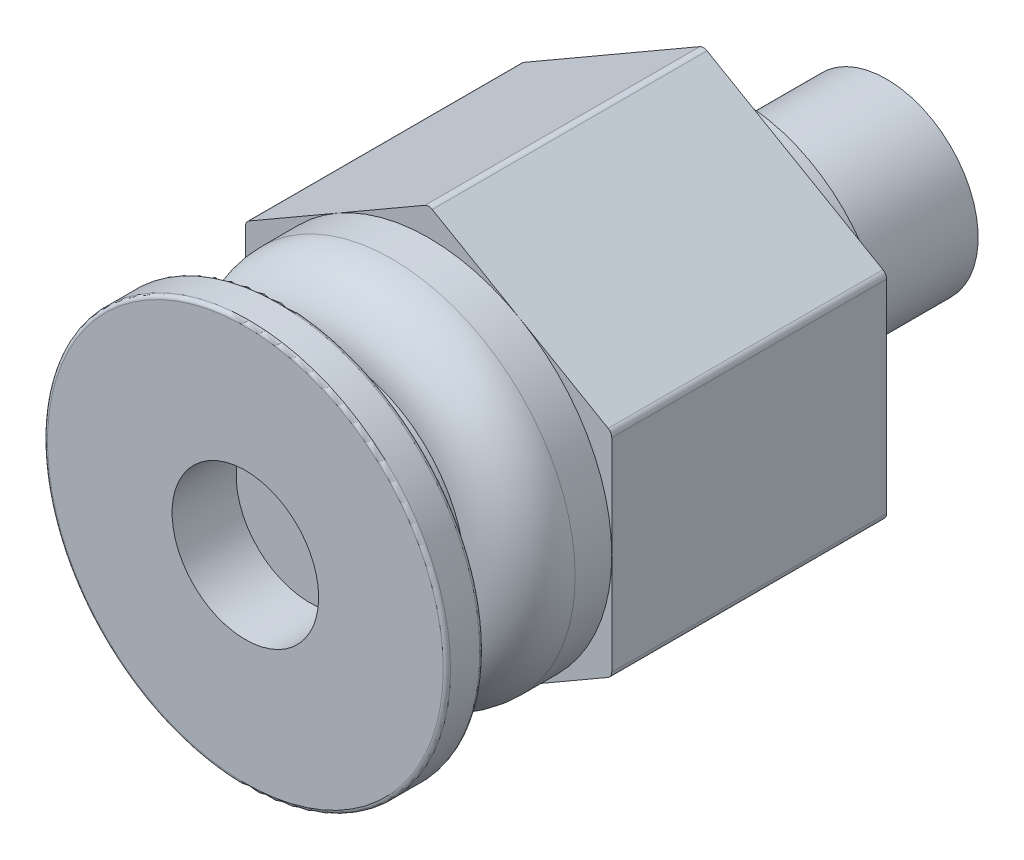
ISO-10303-21;
HEADER;
FILE_DESCRIPTION(('STEP AP214'),'2;1');
FILE_NAME('part.step','',(''),(''),'','','');
FILE_SCHEMA(('AUTOMOTIVE_DESIGN { 1 0 10303 214 1 1 1 1 }'));
ENDSEC;
DATA;
#1=APPLICATION_CONTEXT('core data for automotive mechanical design processes');
#2=APPLICATION_PROTOCOL_DEFINITION('international standard','automotive_design',2000,#1);
#3=PRODUCT_CONTEXT('',#1,'mechanical');
#4=PRODUCT('Part','Part','',(#3));
#5=PRODUCT_RELATED_PRODUCT_CATEGORY('part','',(#4));
#6=PRODUCT_DEFINITION_FORMATION('','',#4);
#7=PRODUCT_DEFINITION_CONTEXT('part definition',#1,'design');
#8=PRODUCT_DEFINITION('design','',#6,#7);
#9=PRODUCT_DEFINITION_SHAPE('','',#8);
#10=(LENGTH_UNIT() NAMED_UNIT(*) SI_UNIT(.MILLI.,.METRE.));
#11=(NAMED_UNIT(*) PLANE_ANGLE_UNIT() SI_UNIT($,.RADIAN.));
#12=(NAMED_UNIT(*) SI_UNIT($,.STERADIAN.) SOLID_ANGLE_UNIT());
#13=UNCERTAINTY_MEASURE_WITH_UNIT(LENGTH_MEASURE(1.E-05),#10,'distance_accuracy_value','');
#14=(GEOMETRIC_REPRESENTATION_CONTEXT(3) GLOBAL_UNCERTAINTY_ASSIGNED_CONTEXT((#13)) GLOBAL_UNIT_ASSIGNED_CONTEXT((#10,
#11,#12)) REPRESENTATION_CONTEXT('',''));
#15=CARTESIAN_POINT('',(0.,0.,0.));
#16=DIRECTION('',(0.,0.,1.));
#17=DIRECTION('',(1.,0.,0.));
#18=AXIS2_PLACEMENT_3D('',#15,#16,#17);
#19=CARTESIAN_POINT('',(0.,0.,15.75));
#20=DIRECTION('',(0.,0.,0.999999999999999));
#21=DIRECTION('',(1.,0.,0.));
#22=AXIS2_PLACEMENT_3D('',#19,#20,#21);
#23=PLANE('',#22);
#24=CARTESIAN_POINT('',(0.,0.,15.75));
#25=DIRECTION('',(0.,0.,-0.999999999999999));
#26=DIRECTION('',(-1.,0.,0.));
#27=AXIS2_PLACEMENT_3D('',#24,#25,#26);
#28=CIRCLE('',#27,2.);
#29=CARTESIAN_POINT('',(1.99999999999997,0.,15.7500000000003));
#30=VERTEX_POINT('',#29);
#31=EDGE_CURVE('E19',#30,#30,#28,.F.);
#32=ORIENTED_EDGE('',*,*,#31,.T.);
#33=EDGE_LOOP('',(#32));
#34=FACE_BOUND('',#33,.T.);
#35=ADVANCED_FACE('F16',(#34),#23,.T.);
#36=CARTESIAN_POINT('',(0.,0.,-6.17664109060523));
#37=DIRECTION('',(0.,0.,-0.999999999999999));
#38=DIRECTION('',(-1.,0.,0.));
#39=AXIS2_PLACEMENT_3D('',#36,#37,#38);
#40=CYLINDRICAL_SURFACE('',#39,2.);
#41=ORIENTED_EDGE('',*,*,#31,.F.);
#42=EDGE_LOOP('',(#41));
#43=FACE_BOUND('',#42,.T.);
#44=CARTESIAN_POINT('',(0.,0.,17.5000000000001));
#45=DIRECTION('',(0.,0.,-0.999999999999999));
#46=DIRECTION('',(-1.,0.,0.));
#47=AXIS2_PLACEMENT_3D('',#44,#45,#46);
#48=CIRCLE('',#47,2.);
#49=CARTESIAN_POINT('',(1.9999999999999,0.,17.4999999999999));
#50=VERTEX_POINT('',#49);
#51=EDGE_CURVE('E34',#50,#50,#48,.T.);
#52=ORIENTED_EDGE('',*,*,#51,.F.);
#53=EDGE_LOOP('',(#52));
#54=FACE_BOUND('',#53,.T.);
#55=ADVANCED_FACE('F362',(#43,#54),#40,.F.);
#56=CARTESIAN_POINT('',(0.,0.,17.5000000000001));
#57=DIRECTION('',(0.,0.,0.999999999999999));
#58=DIRECTION('',(1.,0.,0.));
#59=AXIS2_PLACEMENT_3D('',#56,#57,#58);
#60=PLANE('',#59);
#61=ORIENTED_EDGE('',*,*,#51,.T.);
#62=EDGE_LOOP('',(#61));
#63=FACE_BOUND('',#62,.T.);
#64=CARTESIAN_POINT('',(0.,0.,17.5));
#65=DIRECTION('',(0.,0.,-0.999999999999999));
#66=DIRECTION('',(1.,0.,0.));
#67=AXIS2_PLACEMENT_3D('',#64,#65,#66);
#68=CIRCLE('',#67,5.39999999999998);
#69=CARTESIAN_POINT('',(5.39999999999995,0.,17.5000000000002));
#70=VERTEX_POINT('',#69);
#71=EDGE_CURVE('E257',#70,#70,#68,.T.);
#72=ORIENTED_EDGE('',*,*,#71,.F.);
#73=EDGE_LOOP('',(#72));
#74=FACE_BOUND('',#73,.T.);
#75=ADVANCED_FACE('F268',(#63,#74),#60,.T.);
#76=CARTESIAN_POINT('',(0.,0.,17.4));
#77=DIRECTION('',(0.,0.,0.999999999999999));
#78=DIRECTION('',(-1.,0.,0.));
#79=AXIS2_PLACEMENT_3D('',#76,#77,#78);
#80=TOROIDAL_SURFACE('',#79,5.39999999999997,0.1);
#81=ORIENTED_EDGE('',*,*,#71,.T.);
#82=EDGE_LOOP('',(#81));
#83=FACE_BOUND('',#82,.T.);
#84=CARTESIAN_POINT('',(0.,0.,17.4000000000001));
#85=DIRECTION('',(0.,0.,-0.999999999999999));
#86=DIRECTION('',(-1.,0.,0.));
#87=AXIS2_PLACEMENT_3D('',#84,#85,#86);
#88=CIRCLE('',#87,5.5);
#89=CARTESIAN_POINT('',(-5.50000000000009,0.,17.4));
#90=VERTEX_POINT('',#89);
#91=CARTESIAN_POINT('',(5.49999999999995,0.,17.4000000000002));
#92=VERTEX_POINT('',#91);
#93=EDGE_CURVE('E242',#90,#92,#88,.T.);
#94=ORIENTED_EDGE('',*,*,#93,.F.);
#95=CARTESIAN_POINT('',(0.,0.,17.4000000000001));
#96=DIRECTION('',(0.,0.,-0.999999999999999));
#97=DIRECTION('',(-1.,0.,0.));
#98=AXIS2_PLACEMENT_3D('',#95,#96,#97);
#99=CIRCLE('',#98,5.5);
#100=EDGE_CURVE('E255',#92,#90,#99,.T.);
#101=ORIENTED_EDGE('',*,*,#100,.F.);
#102=EDGE_LOOP('',(#94,#101));
#103=FACE_BOUND('',#102,.T.);
#104=ADVANCED_FACE('F263',(#83,#103),#80,.T.);
#105=CARTESIAN_POINT('',(0.,0.,16.5000000000002));
#106=DIRECTION('',(0.,0.,-0.999999999999999));
#107=DIRECTION('',(-1.,0.,0.));
#108=AXIS2_PLACEMENT_3D('',#105,#106,#107);
#109=CYLINDRICAL_SURFACE('',#108,5.5);
#110=CARTESIAN_POINT('',(0.,0.,16.6000000000002));
#111=DIRECTION('',(0.,0.,-0.999999999999999));
#112=DIRECTION('',(-1.,0.,0.));
#113=AXIS2_PLACEMENT_3D('',#110,#111,#112);
#114=CIRCLE('',#113,5.5);
#115=CARTESIAN_POINT('',(5.49999999999995,0.,16.6000000000001));
#116=VERTEX_POINT('',#115);
#117=CARTESIAN_POINT('',(-5.50000000000004,0.,16.6000000000001));
#118=VERTEX_POINT('',#117);
#119=EDGE_CURVE('E237',#116,#118,#114,.T.);
#120=ORIENTED_EDGE('',*,*,#119,.F.);
#121=CARTESIAN_POINT('',(0.,0.,16.6000000000002));
#122=DIRECTION('',(0.,0.,-0.999999999999999));
#123=DIRECTION('',(-1.,0.,0.));
#124=AXIS2_PLACEMENT_3D('',#121,#122,#123);
#125=CIRCLE('',#124,5.5);
#126=EDGE_CURVE('E240',#118,#116,#125,.T.);
#127=ORIENTED_EDGE('',*,*,#126,.F.);
#128=EDGE_LOOP('',(#120,#127));
#129=FACE_BOUND('',#128,.T.);
#130=ORIENTED_EDGE('',*,*,#100,.T.);
#131=ORIENTED_EDGE('',*,*,#93,.T.);
#132=EDGE_LOOP('',(#130,#131));
#133=FACE_BOUND('',#132,.T.);
#134=ADVANCED_FACE('F267',(#129,#133),#109,.T.);
#135=CARTESIAN_POINT('',(0.,0.,16.6000000000001));
#136=DIRECTION('',(0.,0.,-0.999999999999999));
#137=DIRECTION('',(-1.,0.,0.));
#138=AXIS2_PLACEMENT_3D('',#135,#136,#137);
#139=TOROIDAL_SURFACE('',#138,5.40000000000007,0.1);
#140=ORIENTED_EDGE('',*,*,#126,.T.);
#141=ORIENTED_EDGE('',*,*,#119,.T.);
#142=EDGE_LOOP('',(#140,#141));
#143=FACE_BOUND('',#142,.T.);
#144=CARTESIAN_POINT('',(0.,0.,16.5000000000001));
#145=DIRECTION('',(0.,0.,0.999999999999999));
#146=DIRECTION('',(-1.,0.,0.));
#147=AXIS2_PLACEMENT_3D('',#144,#145,#146);
#148=CIRCLE('',#147,5.40000000000007);
#149=CARTESIAN_POINT('',(-5.40000000000006,0.,16.5000000000002));
#150=VERTEX_POINT('',#149);
#151=EDGE_CURVE('E239',#150,#150,#148,.T.);
#152=ORIENTED_EDGE('',*,*,#151,.T.);
#153=EDGE_LOOP('',(#152));
#154=FACE_BOUND('',#153,.T.);
#155=ADVANCED_FACE('F221',(#143,#154),#139,.T.);
#156=CARTESIAN_POINT('',(0.,0.,16.5000000000002));
#157=DIRECTION('',(0.,0.,0.999999999999999));
#158=DIRECTION('',(1.,0.,0.));
#159=AXIS2_PLACEMENT_3D('',#156,#157,#158);
#160=PLANE('',#159);
#161=CARTESIAN_POINT('',(0.,0.,16.5000000000002));
#162=DIRECTION('',(0.,0.,-0.999999999999999));
#163=DIRECTION('',(-1.,0.,0.));
#164=AXIS2_PLACEMENT_3D('',#161,#162,#163);
#165=CIRCLE('',#164,2.5);
#166=CARTESIAN_POINT('',(-2.50000000000004,0.,16.5));
#167=VERTEX_POINT('',#166);
#168=EDGE_CURVE('E359',#167,#167,#165,.T.);
#169=ORIENTED_EDGE('',*,*,#168,.F.);
#170=EDGE_LOOP('',(#169));
#171=FACE_BOUND('',#170,.T.);
#172=ORIENTED_EDGE('',*,*,#151,.F.);
#173=EDGE_LOOP('',(#172));
#174=FACE_BOUND('',#173,.T.);
#175=ADVANCED_FACE('F216',(#171,#174),#160,.F.);
#176=CARTESIAN_POINT('',(0.,0.,15.0000000000002));
#177=DIRECTION('',(0.,0.,-0.999999999999999));
#178=DIRECTION('',(-1.,0.,0.));
#179=AXIS2_PLACEMENT_3D('',#176,#177,#178);
#180=CYLINDRICAL_SURFACE('',#179,2.5);
#181=CARTESIAN_POINT('',(0.,0.,15.75));
#182=DIRECTION('',(0.,0.,-0.999999999999999));
#183=DIRECTION('',(-1.,0.,0.));
#184=AXIS2_PLACEMENT_3D('',#181,#182,#183);
#185=CIRCLE('',#184,2.5);
#186=CARTESIAN_POINT('',(-2.50000000000006,0.,15.75));
#187=VERTEX_POINT('',#186);
#188=EDGE_CURVE('E357',#187,#187,#185,.T.);
#189=ORIENTED_EDGE('',*,*,#188,.F.);
#190=EDGE_LOOP('',(#189));
#191=FACE_BOUND('',#190,.T.);
#192=ORIENTED_EDGE('',*,*,#168,.T.);
#193=EDGE_LOOP('',(#192));
#194=FACE_BOUND('',#193,.T.);
#195=ADVANCED_FACE('F212',(#191,#194),#180,.T.);
#196=CARTESIAN_POINT('',(0.,0.,15.75));
#197=DIRECTION('',(0.,0.,0.999999999999999));
#198=DIRECTION('',(1.,0.,0.));
#199=AXIS2_PLACEMENT_3D('',#196,#197,#198);
#200=PLANE('',#199);
#201=ORIENTED_EDGE('',*,*,#188,.T.);
#202=EDGE_LOOP('',(#201));
#203=FACE_BOUND('',#202,.T.);
#204=CARTESIAN_POINT('',(0.,0.,15.75));
#205=DIRECTION('',(0.,0.,-0.999999999999999));
#206=DIRECTION('',(-1.,0.,0.));
#207=AXIS2_PLACEMENT_3D('',#204,#205,#206);
#208=CIRCLE('',#207,3.5);
#209=CARTESIAN_POINT('',(-3.50000000000005,0.,15.7500000000004));
#210=VERTEX_POINT('',#209);
#211=EDGE_CURVE('E355',#210,#210,#208,.T.);
#212=ORIENTED_EDGE('',*,*,#211,.F.);
#213=EDGE_LOOP('',(#212));
#214=FACE_BOUND('',#213,.T.);
#215=ADVANCED_FACE('F208',(#203,#214),#200,.T.);
#216=CARTESIAN_POINT('',(0.,0.,15.0000000000002));
#217=DIRECTION('',(0.,0.,-0.999999999999999));
#218=DIRECTION('',(-1.,0.,0.));
#219=AXIS2_PLACEMENT_3D('',#216,#217,#218);
#220=CYLINDRICAL_SURFACE('',#219,3.5);
#221=ORIENTED_EDGE('',*,*,#211,.T.);
#222=EDGE_LOOP('',(#221));
#223=FACE_BOUND('',#222,.T.);
#224=CARTESIAN_POINT('',(0.,0.,15.0000000000002));
#225=DIRECTION('',(0.,0.,0.999999999999999));
#226=DIRECTION('',(-1.,0.,0.));
#227=AXIS2_PLACEMENT_3D('',#224,#225,#226);
#228=CIRCLE('',#227,3.5);
#229=CARTESIAN_POINT('',(-3.50000000000004,0.,15.));
#230=VERTEX_POINT('',#229);
#231=CARTESIAN_POINT('',(3.49999999999996,0.,15.));
#232=VERTEX_POINT('',#231);
#233=EDGE_CURVE('E191',#230,#232,#228,.F.);
#234=ORIENTED_EDGE('',*,*,#233,.F.);
#235=CARTESIAN_POINT('',(0.,0.,15.0000000000002));
#236=DIRECTION('',(0.,0.,0.999999999999999));
#237=DIRECTION('',(-1.,0.,0.));
#238=AXIS2_PLACEMENT_3D('',#235,#236,#237);
#239=CIRCLE('',#238,3.5);
#240=EDGE_CURVE('E193',#232,#230,#239,.F.);
#241=ORIENTED_EDGE('',*,*,#240,.F.);
#242=EDGE_LOOP('',(#234,#241));
#243=FACE_BOUND('',#242,.T.);
#244=ADVANCED_FACE('F203',(#223,#243),#220,.T.);
#245=CARTESIAN_POINT('',(0.,0.,13.5));
#246=DIRECTION('',(0.,0.,0.999999999999999));
#247=DIRECTION('',(-1.,0.,0.));
#248=AXIS2_PLACEMENT_3D('',#245,#246,#247);
#249=TOROIDAL_SURFACE('',#248,3.49999999999995,1.5);
#250=ORIENTED_EDGE('',*,*,#240,.T.);
#251=ORIENTED_EDGE('',*,*,#233,.T.);
#252=EDGE_LOOP('',(#250,#251));
#253=FACE_BOUND('',#252,.T.);
#254=CARTESIAN_POINT('',(0.,0.,13.5000000000002));
#255=DIRECTION('',(0.,0.,-0.999999999999999));
#256=DIRECTION('',(-1.,0.,0.));
#257=AXIS2_PLACEMENT_3D('',#254,#255,#256);
#258=CIRCLE('',#257,5.);
#259=CARTESIAN_POINT('',(-5.00000000000009,0.,13.5000000000003));
#260=VERTEX_POINT('',#259);
#261=CARTESIAN_POINT('',(4.99999999999994,0.,13.5));
#262=VERTEX_POINT('',#261);
#263=EDGE_CURVE('E183',#260,#262,#258,.T.);
#264=ORIENTED_EDGE('',*,*,#263,.F.);
#265=CARTESIAN_POINT('',(0.,0.,13.5000000000002));
#266=DIRECTION('',(0.,0.,-0.999999999999999));
#267=DIRECTION('',(-1.,0.,0.));
#268=AXIS2_PLACEMENT_3D('',#265,#266,#267);
#269=CIRCLE('',#268,5.);
#270=EDGE_CURVE('E186',#262,#260,#269,.T.);
#271=ORIENTED_EDGE('',*,*,#270,.F.);
#272=EDGE_LOOP('',(#264,#271));
#273=FACE_BOUND('',#272,.T.);
#274=ADVANCED_FACE('F190',(#253,#273),#249,.T.);
#275=CARTESIAN_POINT('',(0.,0.,12.5000000000001));
#276=DIRECTION('',(0.,0.,-0.999999999999999));
#277=DIRECTION('',(-1.,0.,0.));
#278=AXIS2_PLACEMENT_3D('',#275,#276,#277);
#279=CYLINDRICAL_SURFACE('',#278,5.);
#280=CARTESIAN_POINT('',(0.,0.,12.5000000000001));
#281=DIRECTION('',(0.,0.,-0.999999999999999));
#282=DIRECTION('',(-1.,0.,0.));
#283=AXIS2_PLACEMENT_3D('',#280,#281,#282);
#284=CIRCLE('',#283,5.);
#285=CARTESIAN_POINT('',(2.49999999999994,-4.33012701892221,12.4999999999998));
#286=VERTEX_POINT('',#285);
#287=CARTESIAN_POINT('',(-2.50000000000008,-4.33012701892222,12.4999999999998));
#288=VERTEX_POINT('',#287);
#289=EDGE_CURVE('E188',#286,#288,#284,.T.);
#290=ORIENTED_EDGE('',*,*,#289,.F.);
#291=CARTESIAN_POINT('',(0.,0.,12.5000000000001));
#292=DIRECTION('',(0.,0.,-0.999999999999999));
#293=DIRECTION('',(-1.,0.,0.));
#294=AXIS2_PLACEMENT_3D('',#291,#292,#293);
#295=CIRCLE('',#294,5.);
#296=CARTESIAN_POINT('',(4.99999999999995,0.,12.5));
#297=VERTEX_POINT('',#296);
#298=EDGE_CURVE('E352',#297,#286,#295,.T.);
#299=ORIENTED_EDGE('',*,*,#298,.F.);
#300=CARTESIAN_POINT('',(0.,0.,12.5000000000001));
#301=DIRECTION('',(0.,0.,-0.999999999999999));
#302=DIRECTION('',(-1.,0.,0.));
#303=AXIS2_PLACEMENT_3D('',#300,#301,#302);
#304=CIRCLE('',#303,5.);
#305=CARTESIAN_POINT('',(2.49999999999994,4.33012701892221,12.5000000000001));
#306=VERTEX_POINT('',#305);
#307=EDGE_CURVE('E350',#306,#297,#304,.T.);
#308=ORIENTED_EDGE('',*,*,#307,.F.);
#309=CARTESIAN_POINT('',(0.,0.,12.5000000000001));
#310=DIRECTION('',(0.,0.,-0.999999999999999));
#311=DIRECTION('',(-1.,0.,0.));
#312=AXIS2_PLACEMENT_3D('',#309,#310,#311);
#313=CIRCLE('',#312,5.);
#314=CARTESIAN_POINT('',(-2.50000000000009,4.33012701892215,12.5));
#315=VERTEX_POINT('',#314);
#316=EDGE_CURVE('E348',#315,#306,#313,.T.);
#317=ORIENTED_EDGE('',*,*,#316,.F.);
#318=CARTESIAN_POINT('',(0.,0.,12.5000000000001));
#319=DIRECTION('',(0.,0.,-0.999999999999999));
#320=DIRECTION('',(-1.,0.,0.));
#321=AXIS2_PLACEMENT_3D('',#318,#319,#320);
#322=CIRCLE('',#321,5.);
#323=CARTESIAN_POINT('',(-5.00000000000007,0.,12.5000000000001));
#324=VERTEX_POINT('',#323);
#325=EDGE_CURVE('E344',#324,#315,#322,.T.);
#326=ORIENTED_EDGE('',*,*,#325,.F.);
#327=CARTESIAN_POINT('',(0.,0.,12.5000000000001));
#328=DIRECTION('',(0.,0.,-0.999999999999999));
#329=DIRECTION('',(-1.,0.,0.));
#330=AXIS2_PLACEMENT_3D('',#327,#328,#329);
#331=CIRCLE('',#330,5.);
#332=EDGE_CURVE('E346',#288,#324,#331,.T.);
#333=ORIENTED_EDGE('',*,*,#332,.F.);
#334=EDGE_LOOP('',(#290,#299,#308,#317,#326,#333));
#335=FACE_BOUND('',#334,.T.);
#336=ORIENTED_EDGE('',*,*,#270,.T.);
#337=ORIENTED_EDGE('',*,*,#263,.T.);
#338=EDGE_LOOP('',(#336,#337));
#339=FACE_BOUND('',#338,.T.);
#340=ADVANCED_FACE('F185',(#335,#339),#279,.T.);
#341=CARTESIAN_POINT('',(0.,0.,12.5000000000001));
#342=DIRECTION('',(0.,0.,0.999999999999999));
#343=DIRECTION('',(1.,0.,0.));
#344=AXIS2_PLACEMENT_3D('',#341,#342,#343);
#345=PLANE('',#344);
#346=ORIENTED_EDGE('',*,*,#289,.T.);
#347=DIRECTION('',(0.866025403784439,-0.5,0.));
#348=VECTOR('',#347,1.);
#349=CARTESIAN_POINT('',(-5.00000000000009,-2.88675134594812,12.5));
#350=LINE('',#349,#348);
#351=CARTESIAN_POINT('',(-0.0999999999999925,-5.71576766497733,12.5000000000001));
#352=VERTEX_POINT('',#351);
#353=EDGE_CURVE('E477',#352,#288,#350,.F.);
#354=ORIENTED_EDGE('',*,*,#353,.F.);
#355=CARTESIAN_POINT('',(0.,-5.54256258422042,12.5000000000002));
#356=DIRECTION('',(0.,0.,-0.999999999999999));
#357=DIRECTION('',(-1.,0.,0.));
#358=AXIS2_PLACEMENT_3D('',#355,#356,#357);
#359=CIRCLE('',#358,0.2);
#360=CARTESIAN_POINT('',(0.0999999999999578,-5.71576766497722,12.5000000000002));
#361=VERTEX_POINT('',#360);
#362=EDGE_CURVE('E336',#361,#352,#359,.T.);
#363=ORIENTED_EDGE('',*,*,#362,.F.);
#364=DIRECTION('',(0.866025403784439,0.5,0.));
#365=VECTOR('',#364,1.);
#366=CARTESIAN_POINT('',(-1.11022302462516E-13,-5.77350269189626,12.5000000000001));
#367=LINE('',#366,#365);
#368=EDGE_CURVE('E478',#286,#361,#367,.F.);
#369=ORIENTED_EDGE('',*,*,#368,.F.);
#370=EDGE_LOOP('',(#346,#354,#363,#369));
#371=FACE_BOUND('',#370,.T.);
#372=ADVANCED_FACE('F465',(#371),#345,.T.);
#373=CARTESIAN_POINT('',(0.,0.,12.5000000000001));
#374=DIRECTION('',(0.,0.,0.999999999999999));
#375=DIRECTION('',(1.,0.,0.));
#376=AXIS2_PLACEMENT_3D('',#373,#374,#375);
#377=PLANE('',#376);
#378=ORIENTED_EDGE('',*,*,#298,.T.);
#379=DIRECTION('',(0.866025403784439,0.5,0.));
#380=VECTOR('',#379,1.);
#381=CARTESIAN_POINT('',(-1.11022302462516E-13,-5.77350269189626,12.5000000000001));
#382=LINE('',#381,#380);
#383=CARTESIAN_POINT('',(4.90000000000002,-2.94448637286709,12.5));
#384=VERTEX_POINT('',#383);
#385=EDGE_CURVE('E339',#384,#286,#382,.F.);
#386=ORIENTED_EDGE('',*,*,#385,.F.);
#387=CARTESIAN_POINT('',(4.79999999999991,-2.77128129211018,12.5000000000001));
#388=DIRECTION('',(0.,0.,-0.999999999999999));
#389=DIRECTION('',(-1.,0.,0.));
#390=AXIS2_PLACEMENT_3D('',#387,#388,#389);
#391=CIRCLE('',#390,0.2);
#392=CARTESIAN_POINT('',(4.99999999999997,-2.77128129211026,12.5000000000001));
#393=VERTEX_POINT('',#392);
#394=EDGE_CURVE('E331',#393,#384,#391,.T.);
#395=ORIENTED_EDGE('',*,*,#394,.F.);
#396=DIRECTION('',(0.,0.999999999999999,0.));
#397=VECTOR('',#396,1.);
#398=CARTESIAN_POINT('',(4.99999999999997,-2.88675134594812,12.5000000000002));
#399=LINE('',#398,#397);
#400=EDGE_CURVE('E499',#297,#393,#399,.F.);
#401=ORIENTED_EDGE('',*,*,#400,.F.);
#402=EDGE_LOOP('',(#378,#386,#395,#401));
#403=FACE_BOUND('',#402,.T.);
#404=ADVANCED_FACE('F462',(#403),#377,.T.);
#405=CARTESIAN_POINT('',(0.,0.,12.5000000000001));
#406=DIRECTION('',(0.,0.,0.999999999999999));
#407=DIRECTION('',(1.,0.,0.));
#408=AXIS2_PLACEMENT_3D('',#405,#406,#407);
#409=PLANE('',#408);
#410=ORIENTED_EDGE('',*,*,#307,.T.);
#411=DIRECTION('',(0.,0.999999999999999,0.));
#412=VECTOR('',#411,1.);
#413=CARTESIAN_POINT('',(4.99999999999997,-2.88675134594812,12.5000000000002));
#414=LINE('',#413,#412);
#415=CARTESIAN_POINT('',(5.,2.77128129211018,12.5000000000001));
#416=VERTEX_POINT('',#415);
#417=EDGE_CURVE('E334',#416,#297,#414,.F.);
#418=ORIENTED_EDGE('',*,*,#417,.F.);
#419=CARTESIAN_POINT('',(4.79999999999992,2.77128129211025,12.5000000000003));
#420=DIRECTION('',(0.,0.,-0.999999999999999));
#421=DIRECTION('',(-1.,0.,0.));
#422=AXIS2_PLACEMENT_3D('',#419,#420,#421);
#423=CIRCLE('',#422,0.2);
#424=CARTESIAN_POINT('',(4.89999999999993,2.94448637286709,12.5));
#425=VERTEX_POINT('',#424);
#426=EDGE_CURVE('E326',#425,#416,#423,.T.);
#427=ORIENTED_EDGE('',*,*,#426,.F.);
#428=DIRECTION('',(-0.866025403784439,0.499999999999999,0.));
#429=VECTOR('',#428,1.);
#430=CARTESIAN_POINT('',(4.99999999999989,2.88675134594809,12.5000000000002));
#431=LINE('',#430,#429);
#432=EDGE_CURVE('E504',#306,#425,#431,.F.);
#433=ORIENTED_EDGE('',*,*,#432,.F.);
#434=EDGE_LOOP('',(#410,#418,#427,#433));
#435=FACE_BOUND('',#434,.T.);
#436=ADVANCED_FACE('F458',(#435),#409,.T.);
#437=CARTESIAN_POINT('',(0.,0.,12.5000000000001));
#438=DIRECTION('',(0.,0.,0.999999999999999));
#439=DIRECTION('',(1.,0.,0.));
#440=AXIS2_PLACEMENT_3D('',#437,#438,#439);
#441=PLANE('',#440);
#442=ORIENTED_EDGE('',*,*,#316,.T.);
#443=DIRECTION('',(-0.866025403784439,0.499999999999999,0.));
#444=VECTOR('',#443,1.);
#445=CARTESIAN_POINT('',(4.99999999999989,2.88675134594809,12.5000000000002));
#446=LINE('',#445,#444);
#447=CARTESIAN_POINT('',(0.0999999999999578,5.71576766497725,12.5000000000001));
#448=VERTEX_POINT('',#447);
#449=EDGE_CURVE('E329',#448,#306,#446,.F.);
#450=ORIENTED_EDGE('',*,*,#449,.F.);
#451=CARTESIAN_POINT('',(0.,5.54256258422042,12.5000000000002));
#452=DIRECTION('',(0.,0.,-0.999999999999999));
#453=DIRECTION('',(-1.,0.,0.));
#454=AXIS2_PLACEMENT_3D('',#451,#452,#453);
#455=CIRCLE('',#454,0.2);
#456=CARTESIAN_POINT('',(-0.10000000000006,5.71576766497733,12.5000000000002));
#457=VERTEX_POINT('',#456);
#458=EDGE_CURVE('E321',#457,#448,#455,.T.);
#459=ORIENTED_EDGE('',*,*,#458,.F.);
#460=DIRECTION('',(-0.866025403784439,-0.5,0.));
#461=VECTOR('',#460,1.);
#462=CARTESIAN_POINT('',(0.,5.77350269189625,12.4999999999998));
#463=LINE('',#462,#461);
#464=EDGE_CURVE('E509',#315,#457,#463,.F.);
#465=ORIENTED_EDGE('',*,*,#464,.F.);
#466=EDGE_LOOP('',(#442,#450,#459,#465));
#467=FACE_BOUND('',#466,.T.);
#468=ADVANCED_FACE('F454',(#467),#441,.T.);
#469=CARTESIAN_POINT('',(0.,0.,12.5000000000001));
#470=DIRECTION('',(0.,0.,0.999999999999999));
#471=DIRECTION('',(1.,0.,0.));
#472=AXIS2_PLACEMENT_3D('',#469,#470,#471);
#473=PLANE('',#472);
#474=ORIENTED_EDGE('',*,*,#332,.T.);
#475=DIRECTION('',(0.,-0.999999999999999,0.));
#476=VECTOR('',#475,1.);
#477=CARTESIAN_POINT('',(-4.99999999999998,2.88675134594812,12.5000000000002));
#478=LINE('',#477,#476);
#479=CARTESIAN_POINT('',(-5.0000000000001,-2.77128129211024,12.5000000000001));
#480=VERTEX_POINT('',#479);
#481=EDGE_CURVE('E514',#480,#324,#478,.F.);
#482=ORIENTED_EDGE('',*,*,#481,.F.);
#483=CARTESIAN_POINT('',(-4.80000000000007,-2.77128129211024,12.5000000000001));
#484=DIRECTION('',(0.,0.,-0.999999999999999));
#485=DIRECTION('',(-1.,0.,0.));
#486=AXIS2_PLACEMENT_3D('',#483,#484,#485);
#487=CIRCLE('',#486,0.2);
#488=CARTESIAN_POINT('',(-4.90000000000007,-2.94448637286715,12.5000000000002));
#489=VERTEX_POINT('',#488);
#490=EDGE_CURVE('E341',#489,#480,#487,.T.);
#491=ORIENTED_EDGE('',*,*,#490,.F.);
#492=DIRECTION('',(0.866025403784439,-0.5,0.));
#493=VECTOR('',#492,1.);
#494=CARTESIAN_POINT('',(-5.00000000000009,-2.88675134594812,12.5));
#495=LINE('',#494,#493);
#496=EDGE_CURVE('E484',#288,#489,#495,.F.);
#497=ORIENTED_EDGE('',*,*,#496,.F.);
#498=EDGE_LOOP('',(#474,#482,#491,#497));
#499=FACE_BOUND('',#498,.T.);
#500=ADVANCED_FACE('F450',(#499),#473,.T.);
#501=CARTESIAN_POINT('',(0.,0.,12.5000000000001));
#502=DIRECTION('',(0.,0.,0.999999999999999));
#503=DIRECTION('',(1.,0.,0.));
#504=AXIS2_PLACEMENT_3D('',#501,#502,#503);
#505=PLANE('',#504);
#506=ORIENTED_EDGE('',*,*,#325,.T.);
#507=DIRECTION('',(-0.866025403784439,-0.5,0.));
#508=VECTOR('',#507,1.);
#509=CARTESIAN_POINT('',(0.,5.77350269189625,12.4999999999998));
#510=LINE('',#509,#508);
#511=CARTESIAN_POINT('',(-4.90000000000002,2.94448637286709,12.5000000000001));
#512=VERTEX_POINT('',#511);
#513=EDGE_CURVE('E324',#512,#315,#510,.F.);
#514=ORIENTED_EDGE('',*,*,#513,.F.);
#515=CARTESIAN_POINT('',(-4.80000000000011,2.77128129211016,12.5));
#516=DIRECTION('',(0.,0.,-0.999999999999999));
#517=DIRECTION('',(-1.,0.,0.));
#518=AXIS2_PLACEMENT_3D('',#515,#516,#517);
#519=CIRCLE('',#518,0.2);
#520=CARTESIAN_POINT('',(-5.00000000000004,2.77128129211018,12.5000000000004));
#521=VERTEX_POINT('',#520);
#522=EDGE_CURVE('E316',#521,#512,#519,.T.);
#523=ORIENTED_EDGE('',*,*,#522,.F.);
#524=DIRECTION('',(0.,-0.999999999999999,0.));
#525=VECTOR('',#524,1.);
#526=CARTESIAN_POINT('',(-4.99999999999998,2.88675134594812,12.5000000000002));
#527=LINE('',#526,#525);
#528=EDGE_CURVE('E516',#324,#521,#527,.F.);
#529=ORIENTED_EDGE('',*,*,#528,.F.);
#530=EDGE_LOOP('',(#506,#514,#523,#529));
#531=FACE_BOUND('',#530,.T.);
#532=ADVANCED_FACE('F446',(#531),#505,.T.);
#533=CARTESIAN_POINT('',(-4.80000000000006,-2.77128129211018,5.));
#534=DIRECTION('',(0.,0.,-0.999999999999999));
#535=DIRECTION('',(-1.,0.,0.));
#536=AXIS2_PLACEMENT_3D('',#533,#534,#535);
#537=CYLINDRICAL_SURFACE('',#536,0.2);
#538=DIRECTION('',(0.,0.,0.999999999999999));
#539=VECTOR('',#538,1.);
#540=CARTESIAN_POINT('',(-4.90000000000009,-2.94448637286709,5.00000000000023));
#541=LINE('',#540,#539);
#542=CARTESIAN_POINT('',(-4.90000000000009,-2.94448637286709,5.00000000000023));
#543=VERTEX_POINT('',#542);
#544=EDGE_CURVE('E343',#489,#543,#541,.F.);
#545=ORIENTED_EDGE('',*,*,#544,.F.);
#546=ORIENTED_EDGE('',*,*,#490,.T.);
#547=DIRECTION('',(0.,0.,0.999999999999999));
#548=VECTOR('',#547,1.);
#549=CARTESIAN_POINT('',(-5.0000000000001,-2.77128129211018,5.));
#550=LINE('',#549,#548);
#551=CARTESIAN_POINT('',(-5.0000000000001,-2.77128129211018,5.));
#552=VERTEX_POINT('',#551);
#553=EDGE_CURVE('E319',#552,#480,#550,.T.);
#554=ORIENTED_EDGE('',*,*,#553,.F.);
#555=CARTESIAN_POINT('',(-4.80000000000006,-2.77128129211018,5.));
#556=DIRECTION('',(0.,0.,-0.999999999999999));
#557=DIRECTION('',(-1.,0.,0.));
#558=AXIS2_PLACEMENT_3D('',#555,#556,#557);
#559=CIRCLE('',#558,0.2);
#560=EDGE_CURVE('E312',#552,#543,#559,.F.);
#561=ORIENTED_EDGE('',*,*,#560,.T.);
#562=EDGE_LOOP('',(#545,#546,#554,#561));
#563=FACE_BOUND('',#562,.T.);
#564=ADVANCED_FACE('F442',(#563),#537,.T.);
#565=CARTESIAN_POINT('',(-5.00000000000009,-2.88675134594812,5.00000000000023));
#566=DIRECTION('',(-0.500000000000001,-0.866025403784438,0.));
#567=DIRECTION('',(0.866025403784439,-0.5,0.));
#568=AXIS2_PLACEMENT_3D('',#565,#566,#567);
#569=PLANE('',#568);
#570=ORIENTED_EDGE('',*,*,#353,.T.);
#571=ORIENTED_EDGE('',*,*,#496,.T.);
#572=ORIENTED_EDGE('',*,*,#544,.T.);
#573=DIRECTION('',(0.866025403784439,-0.499999999999999,0.));
#574=VECTOR('',#573,1.);
#575=CARTESIAN_POINT('',(-4.90000000000009,-2.94448637286709,5.00000000000023));
#576=LINE('',#575,#574);
#577=CARTESIAN_POINT('',(-0.100000000000048,-5.71576766497731,5.));
#578=VERTEX_POINT('',#577);
#579=EDGE_CURVE('E311',#543,#578,#576,.T.);
#580=ORIENTED_EDGE('',*,*,#579,.T.);
#581=DIRECTION('',(0.,0.,-0.999999999999999));
#582=VECTOR('',#581,1.);
#583=CARTESIAN_POINT('',(-0.0999999999999925,-5.71576766497731,5.));
#584=LINE('',#583,#582);
#585=EDGE_CURVE('E340',#352,#578,#584,.T.);
#586=ORIENTED_EDGE('',*,*,#585,.F.);
#587=EDGE_LOOP('',(#570,#571,#572,#580,#586));
#588=FACE_BOUND('',#587,.T.);
#589=ADVANCED_FACE('F438',(#588),#569,.T.);
#590=CARTESIAN_POINT('',(0.,-5.54256258422042,5.00000000000045));
#591=DIRECTION('',(0.,0.,-0.999999999999999));
#592=DIRECTION('',(-1.,0.,0.));
#593=AXIS2_PLACEMENT_3D('',#590,#591,#592);
#594=CYLINDRICAL_SURFACE('',#593,0.2);
#595=DIRECTION('',(0.,0.,0.999999999999999));
#596=VECTOR('',#595,1.);
#597=CARTESIAN_POINT('',(0.0999999999999612,-5.71576766497728,5.));
#598=LINE('',#597,#596);
#599=CARTESIAN_POINT('',(0.0999999999999231,-5.71576766497731,5.));
#600=VERTEX_POINT('',#599);
#601=EDGE_CURVE('E496',#361,#600,#598,.F.);
#602=ORIENTED_EDGE('',*,*,#601,.F.);
#603=ORIENTED_EDGE('',*,*,#362,.T.);
#604=ORIENTED_EDGE('',*,*,#585,.T.);
#605=CARTESIAN_POINT('',(0.,-5.54256258422042,5.00000000000045));
#606=DIRECTION('',(0.,0.,-0.999999999999999));
#607=DIRECTION('',(-1.,0.,0.));
#608=AXIS2_PLACEMENT_3D('',#605,#606,#607);
#609=CIRCLE('',#608,0.2);
#610=EDGE_CURVE('E308',#578,#600,#609,.F.);
#611=ORIENTED_EDGE('',*,*,#610,.T.);
#612=EDGE_LOOP('',(#602,#603,#604,#611));
#613=FACE_BOUND('',#612,.T.);
#614=ADVANCED_FACE('F434',(#613),#594,.T.);
#615=CARTESIAN_POINT('',(-1.14491749414469E-13,-5.77350269189624,5.));
#616=DIRECTION('',(0.5,-0.866025403784438,0.));
#617=DIRECTION('',(0.866025403784439,0.5,0.));
#618=AXIS2_PLACEMENT_3D('',#615,#616,#617);
#619=PLANE('',#618);
#620=ORIENTED_EDGE('',*,*,#601,.T.);
#621=DIRECTION('',(0.86602540378444,0.499999999999998,0.));
#622=VECTOR('',#621,1.);
#623=CARTESIAN_POINT('',(0.0999999999999231,-5.71576766497731,5.));
#624=LINE('',#623,#622);
#625=CARTESIAN_POINT('',(4.90000000000001,-2.9444863728671,5.));
#626=VERTEX_POINT('',#625);
#627=EDGE_CURVE('E307',#600,#626,#624,.T.);
#628=ORIENTED_EDGE('',*,*,#627,.T.);
#629=DIRECTION('',(0.,0.,-0.999999999999999));
#630=VECTOR('',#629,1.);
#631=CARTESIAN_POINT('',(4.90000000000001,-2.9444863728671,5.));
#632=LINE('',#631,#630);
#633=EDGE_CURVE('E335',#384,#626,#632,.T.);
#634=ORIENTED_EDGE('',*,*,#633,.F.);
#635=ORIENTED_EDGE('',*,*,#385,.T.);
#636=ORIENTED_EDGE('',*,*,#368,.T.);
#637=EDGE_LOOP('',(#620,#628,#634,#635,#636));
#638=FACE_BOUND('',#637,.T.);
#639=ADVANCED_FACE('F430',(#638),#619,.T.);
#640=CARTESIAN_POINT('',(4.79999999999991,-2.77128129211015,5.));
#641=DIRECTION('',(0.,0.,-0.999999999999999));
#642=DIRECTION('',(-1.,0.,0.));
#643=AXIS2_PLACEMENT_3D('',#640,#641,#642);
#644=CYLINDRICAL_SURFACE('',#643,0.2);
#645=DIRECTION('',(0.,0.,0.999999999999999));
#646=VECTOR('',#645,1.);
#647=CARTESIAN_POINT('',(4.99999999999995,-2.77128129211025,5.00000000000023));
#648=LINE('',#647,#646);
#649=CARTESIAN_POINT('',(4.99999999999995,-2.77128129211025,5.00000000000023));
#650=VERTEX_POINT('',#649);
#651=EDGE_CURVE('E501',#393,#650,#648,.F.);
#652=ORIENTED_EDGE('',*,*,#651,.F.);
#653=ORIENTED_EDGE('',*,*,#394,.T.);
#654=ORIENTED_EDGE('',*,*,#633,.T.);
#655=CARTESIAN_POINT('',(4.79999999999991,-2.77128129211015,5.));
#656=DIRECTION('',(0.,0.,-0.999999999999999));
#657=DIRECTION('',(-1.,0.,0.));
#658=AXIS2_PLACEMENT_3D('',#655,#656,#657);
#659=CIRCLE('',#658,0.2);
#660=EDGE_CURVE('E304',#626,#650,#659,.F.);
#661=ORIENTED_EDGE('',*,*,#660,.T.);
#662=EDGE_LOOP('',(#652,#653,#654,#661));
#663=FACE_BOUND('',#662,.T.);
#664=ADVANCED_FACE('F426',(#663),#644,.T.);
#665=CARTESIAN_POINT('',(5.,-2.88675134594815,5.00000000000023));
#666=DIRECTION('',(1.,0.,0.));
#667=DIRECTION('',(0.,0.999999999999999,0.));
#668=AXIS2_PLACEMENT_3D('',#665,#666,#667);
#669=PLANE('',#668);
#670=ORIENTED_EDGE('',*,*,#651,.T.);
#671=DIRECTION('',(0.,0.999999999999999,0.));
#672=VECTOR('',#671,1.);
#673=CARTESIAN_POINT('',(4.99999999999995,0.,5.00000000000023));
#674=LINE('',#673,#672);
#675=CARTESIAN_POINT('',(5.,2.77128129211018,4.99999999999978));
#676=VERTEX_POINT('',#675);
#677=EDGE_CURVE('E303',#650,#676,#674,.T.);
#678=ORIENTED_EDGE('',*,*,#677,.T.);
#679=DIRECTION('',(0.,0.,-0.999999999999999));
#680=VECTOR('',#679,1.);
#681=CARTESIAN_POINT('',(5.,2.77128129211018,4.99999999999978));
#682=LINE('',#681,#680);
#683=EDGE_CURVE('E330',#416,#676,#682,.T.);
#684=ORIENTED_EDGE('',*,*,#683,.F.);
#685=ORIENTED_EDGE('',*,*,#417,.T.);
#686=ORIENTED_EDGE('',*,*,#400,.T.);
#687=EDGE_LOOP('',(#670,#678,#684,#685,#686));
#688=FACE_BOUND('',#687,.T.);
#689=ADVANCED_FACE('F422',(#688),#669,.T.);
#690=CARTESIAN_POINT('',(4.79999999999994,2.77128129211024,5.00000000000023));
#691=DIRECTION('',(0.,0.,-0.999999999999999));
#692=DIRECTION('',(-1.,0.,0.));
#693=AXIS2_PLACEMENT_3D('',#690,#691,#692);
#694=CYLINDRICAL_SURFACE('',#693,0.2);
#695=DIRECTION('',(0.,0.,0.999999999999999));
#696=VECTOR('',#695,1.);
#697=CARTESIAN_POINT('',(4.89999999999993,2.9444863728671,5.00000000000023));
#698=LINE('',#697,#696);
#699=CARTESIAN_POINT('',(4.89999999999993,2.9444863728671,5.00000000000023));
#700=VERTEX_POINT('',#699);
#701=EDGE_CURVE('E506',#425,#700,#698,.F.);
#702=ORIENTED_EDGE('',*,*,#701,.F.);
#703=ORIENTED_EDGE('',*,*,#426,.T.);
#704=ORIENTED_EDGE('',*,*,#683,.T.);
#705=CARTESIAN_POINT('',(4.79999999999994,2.77128129211024,5.00000000000023));
#706=DIRECTION('',(0.,0.,-0.999999999999999));
#707=DIRECTION('',(-1.,0.,0.));
#708=AXIS2_PLACEMENT_3D('',#705,#706,#707);
#709=CIRCLE('',#708,0.2);
#710=EDGE_CURVE('E300',#676,#700,#709,.F.);
#711=ORIENTED_EDGE('',*,*,#710,.T.);
#712=EDGE_LOOP('',(#702,#703,#704,#711));
#713=FACE_BOUND('',#712,.T.);
#714=ADVANCED_FACE('F418',(#713),#694,.T.);
#715=CARTESIAN_POINT('',(4.99999999999991,2.88675134594812,5.));
#716=DIRECTION('',(0.5,0.866025403784438,0.));
#717=DIRECTION('',(-0.866025403784439,0.499999999999999,0.));
#718=AXIS2_PLACEMENT_3D('',#715,#716,#717);
#719=PLANE('',#718);
#720=ORIENTED_EDGE('',*,*,#701,.T.);
#721=DIRECTION('',(-0.866025403784439,0.499999999999999,0.));
#722=VECTOR('',#721,1.);
#723=CARTESIAN_POINT('',(4.89999999999993,2.9444863728671,5.00000000000023));
#724=LINE('',#723,#722);
#725=CARTESIAN_POINT('',(0.0999999999999855,5.71576766497728,5.));
#726=VERTEX_POINT('',#725);
#727=EDGE_CURVE('E299',#700,#726,#724,.T.);
#728=ORIENTED_EDGE('',*,*,#727,.T.);
#729=DIRECTION('',(0.,0.,-0.999999999999999));
#730=VECTOR('',#729,1.);
#731=CARTESIAN_POINT('',(0.0999999999999855,5.71576766497728,5.));
#732=LINE('',#731,#730);
#733=EDGE_CURVE('E325',#448,#726,#732,.T.);
#734=ORIENTED_EDGE('',*,*,#733,.F.);
#735=ORIENTED_EDGE('',*,*,#449,.T.);
#736=ORIENTED_EDGE('',*,*,#432,.T.);
#737=EDGE_LOOP('',(#720,#728,#734,#735,#736));
#738=FACE_BOUND('',#737,.T.);
#739=ADVANCED_FACE('F414',(#738),#719,.T.);
#740=CARTESIAN_POINT('',(0.,5.54256258422036,5.00000000000023));
#741=DIRECTION('',(0.,0.,-0.999999999999999));
#742=DIRECTION('',(-1.,0.,0.));
#743=AXIS2_PLACEMENT_3D('',#740,#741,#742);
#744=CYLINDRICAL_SURFACE('',#743,0.2);
#745=DIRECTION('',(0.,0.,0.999999999999999));
#746=VECTOR('',#745,1.);
#747=CARTESIAN_POINT('',(-0.100000000000076,5.71576766497727,5.00000000000023));
#748=LINE('',#747,#746);
#749=CARTESIAN_POINT('',(-0.100000000000076,5.71576766497727,5.00000000000023));
#750=VERTEX_POINT('',#749);
#751=EDGE_CURVE('E511',#457,#750,#748,.F.);
#752=ORIENTED_EDGE('',*,*,#751,.F.);
#753=ORIENTED_EDGE('',*,*,#458,.T.);
#754=ORIENTED_EDGE('',*,*,#733,.T.);
#755=CARTESIAN_POINT('',(0.,5.54256258422036,5.00000000000023));
#756=DIRECTION('',(0.,0.,-0.999999999999999));
#757=DIRECTION('',(-1.,0.,0.));
#758=AXIS2_PLACEMENT_3D('',#755,#756,#757);
#759=CIRCLE('',#758,0.2);
#760=EDGE_CURVE('E296',#726,#750,#759,.F.);
#761=ORIENTED_EDGE('',*,*,#760,.T.);
#762=EDGE_LOOP('',(#752,#753,#754,#761));
#763=FACE_BOUND('',#762,.T.);
#764=ADVANCED_FACE('F410',(#763),#744,.T.);
#765=CARTESIAN_POINT('',(0.,5.77350269189625,5.));
#766=DIRECTION('',(-0.5,0.866025403784438,0.));
#767=DIRECTION('',(-0.866025403784439,-0.5,0.));
#768=AXIS2_PLACEMENT_3D('',#765,#766,#767);
#769=PLANE('',#768);
#770=ORIENTED_EDGE('',*,*,#751,.T.);
#771=DIRECTION('',(-0.86602540378444,-0.499999999999998,0.));
#772=VECTOR('',#771,1.);
#773=CARTESIAN_POINT('',(-0.100000000000076,5.71576766497727,5.00000000000023));
#774=LINE('',#773,#772);
#775=CARTESIAN_POINT('',(-4.90000000000002,2.94448637286709,4.99999999999978));
#776=VERTEX_POINT('',#775);
#777=EDGE_CURVE('E295',#750,#776,#774,.T.);
#778=ORIENTED_EDGE('',*,*,#777,.T.);
#779=DIRECTION('',(0.,0.,-0.999999999999999));
#780=VECTOR('',#779,1.);
#781=CARTESIAN_POINT('',(-4.90000000000002,2.94448637286709,4.99999999999978));
#782=LINE('',#781,#780);
#783=EDGE_CURVE('E320',#512,#776,#782,.T.);
#784=ORIENTED_EDGE('',*,*,#783,.F.);
#785=ORIENTED_EDGE('',*,*,#513,.T.);
#786=ORIENTED_EDGE('',*,*,#464,.T.);
#787=EDGE_LOOP('',(#770,#778,#784,#785,#786));
#788=FACE_BOUND('',#787,.T.);
#789=ADVANCED_FACE('F406',(#788),#769,.T.);
#790=CARTESIAN_POINT('',(-4.80000000000011,2.77128129211018,5.));
#791=DIRECTION('',(0.,0.,-0.999999999999999));
#792=DIRECTION('',(-1.,0.,0.));
#793=AXIS2_PLACEMENT_3D('',#790,#791,#792);
#794=CYLINDRICAL_SURFACE('',#793,0.2);
#795=DIRECTION('',(0.,0.,0.999999999999999));
#796=VECTOR('',#795,1.);
#797=CARTESIAN_POINT('',(-5.00000000000005,2.77128129211018,4.99999999999978));
#798=LINE('',#797,#796);
#799=CARTESIAN_POINT('',(-5.00000000000005,2.77128129211018,4.99999999999978));
#800=VERTEX_POINT('',#799);
#801=EDGE_CURVE('E315',#521,#800,#798,.F.);
#802=ORIENTED_EDGE('',*,*,#801,.F.);
#803=ORIENTED_EDGE('',*,*,#522,.T.);
#804=ORIENTED_EDGE('',*,*,#783,.T.);
#805=CARTESIAN_POINT('',(-4.80000000000011,2.77128129211018,5.));
#806=DIRECTION('',(0.,0.,-0.999999999999999));
#807=DIRECTION('',(-1.,0.,0.));
#808=AXIS2_PLACEMENT_3D('',#805,#806,#807);
#809=CIRCLE('',#808,0.2);
#810=EDGE_CURVE('E292',#776,#800,#809,.F.);
#811=ORIENTED_EDGE('',*,*,#810,.T.);
#812=EDGE_LOOP('',(#802,#803,#804,#811));
#813=FACE_BOUND('',#812,.T.);
#814=ADVANCED_FACE('F402',(#813),#794,.T.);
#815=CARTESIAN_POINT('',(-5.00000000000001,2.88675134594812,4.99999999999978));
#816=DIRECTION('',(-1.,0.,0.));
#817=DIRECTION('',(0.,-0.999999999999999,0.));
#818=AXIS2_PLACEMENT_3D('',#815,#816,#817);
#819=PLANE('',#818);
#820=ORIENTED_EDGE('',*,*,#801,.T.);
#821=DIRECTION('',(0.,0.999999999999999,0.));
#822=VECTOR('',#821,1.);
#823=CARTESIAN_POINT('',(-5.00000000000006,0.,5.));
#824=LINE('',#823,#822);
#825=EDGE_CURVE('E291',#800,#552,#824,.F.);
#826=ORIENTED_EDGE('',*,*,#825,.T.);
#827=ORIENTED_EDGE('',*,*,#553,.T.);
#828=ORIENTED_EDGE('',*,*,#481,.T.);
#829=ORIENTED_EDGE('',*,*,#528,.T.);
#830=EDGE_LOOP('',(#820,#826,#827,#828,#829));
#831=FACE_BOUND('',#830,.T.);
#832=ADVANCED_FACE('F398',(#831),#819,.T.);
#833=CARTESIAN_POINT('',(0.,0.,5.));
#834=DIRECTION('',(0.,0.,0.999999999999999));
#835=DIRECTION('',(1.,0.,0.));
#836=AXIS2_PLACEMENT_3D('',#833,#834,#835);
#837=PLANE('',#836);
#838=CARTESIAN_POINT('',(0.,0.,5.));
#839=DIRECTION('',(0.,0.,0.999999999999999));
#840=DIRECTION('',(1.,0.,0.));
#841=AXIS2_PLACEMENT_3D('',#838,#839,#840);
#842=CIRCLE('',#841,4.);
#843=CARTESIAN_POINT('',(-4.00000000000006,0.,5.00000000000023));
#844=VERTEX_POINT('',#843);
#845=EDGE_CURVE('E289',#844,#844,#842,.F.);
#846=ORIENTED_EDGE('',*,*,#845,.F.);
#847=EDGE_LOOP('',(#846));
#848=FACE_BOUND('',#847,.T.);
#849=ORIENTED_EDGE('',*,*,#810,.F.);
#850=ORIENTED_EDGE('',*,*,#777,.F.);
#851=ORIENTED_EDGE('',*,*,#760,.F.);
#852=ORIENTED_EDGE('',*,*,#727,.F.);
#853=ORIENTED_EDGE('',*,*,#710,.F.);
#854=ORIENTED_EDGE('',*,*,#677,.F.);
#855=ORIENTED_EDGE('',*,*,#660,.F.);
#856=ORIENTED_EDGE('',*,*,#627,.F.);
#857=ORIENTED_EDGE('',*,*,#610,.F.);
#858=ORIENTED_EDGE('',*,*,#579,.F.);
#859=ORIENTED_EDGE('',*,*,#560,.F.);
#860=ORIENTED_EDGE('',*,*,#825,.F.);
#861=EDGE_LOOP('',(#849,#850,#851,#852,#853,#854,#855,#856,#857,#858,#859,#860));
#862=FACE_BOUND('',#861,.T.);
#863=ADVANCED_FACE('F394',(#848,#862),#837,.F.);
#864=CARTESIAN_POINT('',(0.,0.,4.50000000000006));
#865=DIRECTION('',(0.,0.,0.999999999999999));
#866=DIRECTION('',(1.,0.,0.));
#867=AXIS2_PLACEMENT_3D('',#864,#865,#866);
#868=CYLINDRICAL_SURFACE('',#867,4.);
#869=CARTESIAN_POINT('',(0.,0.,4.00000000000011));
#870=DIRECTION('',(0.,0.,0.999999999999999));
#871=DIRECTION('',(1.,0.,0.));
#872=AXIS2_PLACEMENT_3D('',#869,#870,#871);
#873=CIRCLE('',#872,4.);
#874=CARTESIAN_POINT('',(-4.00000000000006,0.,4.));
#875=VERTEX_POINT('',#874);
#876=EDGE_CURVE('E287',#875,#875,#873,.F.);
#877=ORIENTED_EDGE('',*,*,#876,.F.);
#878=EDGE_LOOP('',(#877));
#879=FACE_BOUND('',#878,.T.);
#880=ORIENTED_EDGE('',*,*,#845,.T.);
#881=EDGE_LOOP('',(#880));
#882=FACE_BOUND('',#881,.T.);
#883=ADVANCED_FACE('F390',(#879,#882),#868,.T.);
#884=CARTESIAN_POINT('',(-2.50000000000004,0.,4.));
#885=DIRECTION('',(0.,0.,-0.999999999999999));
#886=DIRECTION('',(-1.,0.,0.));
#887=AXIS2_PLACEMENT_3D('',#884,#885,#886);
#888=PLANE('',#887);
#889=CARTESIAN_POINT('',(0.,0.,4.00000000000011));
#890=DIRECTION('',(0.,0.,0.999999999999999));
#891=DIRECTION('',(1.,0.,0.));
#892=AXIS2_PLACEMENT_3D('',#889,#890,#891);
#893=CIRCLE('',#892,2.5);
#894=CARTESIAN_POINT('',(-2.50000000000004,0.,4.));
#895=VERTEX_POINT('',#894);
#896=EDGE_CURVE('E285',#895,#895,#893,.F.);
#897=ORIENTED_EDGE('',*,*,#896,.F.);
#898=EDGE_LOOP('',(#897));
#899=FACE_BOUND('',#898,.T.);
#900=ORIENTED_EDGE('',*,*,#876,.T.);
#901=EDGE_LOOP('',(#900));
#902=FACE_BOUND('',#901,.T.);
#903=ADVANCED_FACE('F386',(#899,#902),#888,.T.);
#904=CARTESIAN_POINT('',(0.,0.,2.));
#905=DIRECTION('',(0.,0.,0.999999999999999));
#906=DIRECTION('',(1.,0.,0.));
#907=AXIS2_PLACEMENT_3D('',#904,#905,#906);
#908=CYLINDRICAL_SURFACE('',#907,2.5);
#909=CARTESIAN_POINT('',(0.,0.,0.));
#910=DIRECTION('',(0.,0.,0.999999999999999));
#911=DIRECTION('',(1.,0.,0.));
#912=AXIS2_PLACEMENT_3D('',#909,#910,#911);
#913=CIRCLE('',#912,2.5);
#914=CARTESIAN_POINT('',(-2.50000000000006,0.,2.22044604925031E-13));
#915=VERTEX_POINT('',#914);
#916=EDGE_CURVE('E283',#915,#915,#913,.F.);
#917=ORIENTED_EDGE('',*,*,#916,.F.);
#918=EDGE_LOOP('',(#917));
#919=FACE_BOUND('',#918,.T.);
#920=ORIENTED_EDGE('',*,*,#896,.T.);
#921=EDGE_LOOP('',(#920));
#922=FACE_BOUND('',#921,.T.);
#923=ADVANCED_FACE('F382',(#919,#922),#908,.T.);
#924=CARTESIAN_POINT('',(0.,0.,15.0000000000002));
#925=DIRECTION('',(0.,0.,0.999999999999999));
#926=DIRECTION('',(1.,0.,0.));
#927=AXIS2_PLACEMENT_3D('',#924,#925,#926);
#928=PLANE('',#927);
#929=CARTESIAN_POINT('',(0.,0.,15.0000000000002));
#930=DIRECTION('',(0.,0.,-0.999999999999999));
#931=DIRECTION('',(-1.,0.,0.));
#932=AXIS2_PLACEMENT_3D('',#929,#930,#931);
#933=CIRCLE('',#932,2.);
#934=CARTESIAN_POINT('',(1.99999999999995,0.,15.0000000000002));
#935=VERTEX_POINT('',#934);
#936=EDGE_CURVE('E24',#935,#935,#933,.T.);
#937=ORIENTED_EDGE('',*,*,#936,.T.);
#938=EDGE_LOOP('',(#937));
#939=FACE_BOUND('',#938,.T.);
#940=ADVANCED_FACE('F375',(#939),#928,.F.);
#941=CARTESIAN_POINT('',(0.,0.,0.));
#942=DIRECTION('',(0.,0.,-0.999999999999999));
#943=DIRECTION('',(-1.,0.,0.));
#944=AXIS2_PLACEMENT_3D('',#941,#942,#943);
#945=PLANE('',#944);
#946=CARTESIAN_POINT('',(0.,0.,0.));
#947=DIRECTION('',(0.,0.,-0.999999999999999));
#948=DIRECTION('',(-1.,0.,0.));
#949=AXIS2_PLACEMENT_3D('',#946,#947,#948);
#950=CIRCLE('',#949,2.);
#951=CARTESIAN_POINT('',(1.99999999999996,0.,0.));
#952=VERTEX_POINT('',#951);
#953=EDGE_CURVE('E11',#952,#952,#950,.F.);
#954=ORIENTED_EDGE('',*,*,#953,.T.);
#955=EDGE_LOOP('',(#954));
#956=FACE_BOUND('',#955,.T.);
#957=ORIENTED_EDGE('',*,*,#916,.T.);
#958=EDGE_LOOP('',(#957));
#959=FACE_BOUND('',#958,.T.);
#960=ADVANCED_FACE('F369',(#956,#959),#945,.T.);
#961=CARTESIAN_POINT('',(0.,0.,-6.17664109060523));
#962=DIRECTION('',(0.,0.,-0.999999999999999));
#963=DIRECTION('',(-1.,0.,0.));
#964=AXIS2_PLACEMENT_3D('',#961,#962,#963);
#965=CYLINDRICAL_SURFACE('',#964,2.);
#966=ORIENTED_EDGE('',*,*,#953,.F.);
#967=EDGE_LOOP('',(#966));
#968=FACE_BOUND('',#967,.T.);
#969=ORIENTED_EDGE('',*,*,#936,.F.);
#970=EDGE_LOOP('',(#969));
#971=FACE_BOUND('',#970,.T.);
#972=ADVANCED_FACE('F367',(#968,#971),#965,.F.);
#973=CLOSED_SHELL('',(#35,#55,#75,#104,#134,#155,#175,#195,#215,#244,#274,#340,#372,#404,#436,
#468,#500,#532,#564,#589,#614,#639,#664,#689,#714,#739,#764,#789,#814,#832,#863,#883,#903,#923,
#940,#960,#972));
#974=MANIFOLD_SOLID_BREP('B1',#973);
#975=ADVANCED_BREP_SHAPE_REPRESENTATION('',(#18,#974),#14);
#976=SHAPE_DEFINITION_REPRESENTATION(#9,#975);
ENDSEC;
END-ISO-10303-21;
